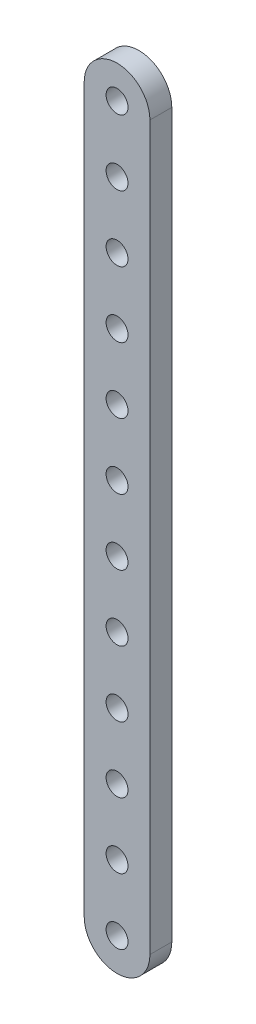
ISO-10303-21;
HEADER;
FILE_DESCRIPTION(('STEP AP214'),'2;1');
FILE_NAME('part.step','',(''),(''),'','','');
FILE_SCHEMA(('AUTOMOTIVE_DESIGN { 1 0 10303 214 1 1 1 1 }'));
ENDSEC;
DATA;
#1=APPLICATION_CONTEXT('core data for automotive mechanical design processes');
#2=APPLICATION_PROTOCOL_DEFINITION('international standard','automotive_design',2000,#1);
#3=PRODUCT_CONTEXT('',#1,'mechanical');
#4=PRODUCT('Part','Part','',(#3));
#5=PRODUCT_RELATED_PRODUCT_CATEGORY('part','',(#4));
#6=PRODUCT_DEFINITION_FORMATION('','',#4);
#7=PRODUCT_DEFINITION_CONTEXT('part definition',#1,'design');
#8=PRODUCT_DEFINITION('design','',#6,#7);
#9=PRODUCT_DEFINITION_SHAPE('','',#8);
#10=(LENGTH_UNIT() NAMED_UNIT(*) SI_UNIT(.MILLI.,.METRE.));
#11=(NAMED_UNIT(*) PLANE_ANGLE_UNIT() SI_UNIT($,.RADIAN.));
#12=(NAMED_UNIT(*) SI_UNIT($,.STERADIAN.) SOLID_ANGLE_UNIT());
#13=UNCERTAINTY_MEASURE_WITH_UNIT(LENGTH_MEASURE(1.E-05),#10,'distance_accuracy_value','');
#14=(GEOMETRIC_REPRESENTATION_CONTEXT(3) GLOBAL_UNCERTAINTY_ASSIGNED_CONTEXT((#13)) GLOBAL_UNIT_ASSIGNED_CONTEXT((#10,
#11,#12)) REPRESENTATION_CONTEXT('',''));
#15=CARTESIAN_POINT('',(0.,0.,0.));
#16=DIRECTION('',(0.,0.,1.));
#17=DIRECTION('',(1.,0.,0.));
#18=AXIS2_PLACEMENT_3D('',#15,#16,#17);
#19=CARTESIAN_POINT('',(208.7507761496,89.428489513,3.));
#20=DIRECTION('',(0.,0.,1.));
#21=DIRECTION('',(1.,0.,0.));
#22=AXIS2_PLACEMENT_3D('',#19,#20,#21);
#23=PLANE('',#22);
#24=CARTESIAN_POINT('',(208.7507761496,98.428489513,3.));
#25=DIRECTION('',(0.,0.,1.));
#26=DIRECTION('',(1.,0.,0.));
#27=AXIS2_PLACEMENT_3D('',#24,#25,#26);
#28=CIRCLE('',#27,1.5);
#29=CARTESIAN_POINT('',(210.2507761496,98.428489513,3.));
#30=VERTEX_POINT('',#29);
#31=EDGE_CURVE('E169',#30,#30,#28,.T.);
#32=ORIENTED_EDGE('',*,*,#31,.F.);
#33=EDGE_LOOP('',(#32));
#34=FACE_BOUND('',#33,.T.);
#35=CARTESIAN_POINT('',(208.7507761496,134.428489513,3.));
#36=DIRECTION('',(0.,0.,1.));
#37=DIRECTION('',(1.,0.,0.));
#38=AXIS2_PLACEMENT_3D('',#35,#36,#37);
#39=CIRCLE('',#38,1.5);
#40=CARTESIAN_POINT('',(210.2507761496,134.428489513,3.));
#41=VERTEX_POINT('',#40);
#42=EDGE_CURVE('E157',#41,#41,#39,.T.);
#43=ORIENTED_EDGE('',*,*,#42,.F.);
#44=EDGE_LOOP('',(#43));
#45=FACE_BOUND('',#44,.T.);
#46=CARTESIAN_POINT('',(208.7507761496,116.428489513,3.));
#47=DIRECTION('',(0.,0.,1.));
#48=DIRECTION('',(1.,0.,0.));
#49=AXIS2_PLACEMENT_3D('',#46,#47,#48);
#50=CIRCLE('',#49,1.5);
#51=CARTESIAN_POINT('',(210.2507761496,116.428489513,3.));
#52=VERTEX_POINT('',#51);
#53=EDGE_CURVE('E145',#52,#52,#50,.T.);
#54=ORIENTED_EDGE('',*,*,#53,.F.);
#55=EDGE_LOOP('',(#54));
#56=FACE_BOUND('',#55,.T.);
#57=CARTESIAN_POINT('',(208.7507761496,170.428489513,3.));
#58=DIRECTION('',(0.,0.,1.));
#59=DIRECTION('',(1.,0.,0.));
#60=AXIS2_PLACEMENT_3D('',#57,#58,#59);
#61=CIRCLE('',#60,1.5);
#62=CARTESIAN_POINT('',(210.2507761496,170.428489513,3.));
#63=VERTEX_POINT('',#62);
#64=EDGE_CURVE('E133',#63,#63,#61,.T.);
#65=ORIENTED_EDGE('',*,*,#64,.F.);
#66=EDGE_LOOP('',(#65));
#67=FACE_BOUND('',#66,.T.);
#68=CARTESIAN_POINT('',(208.7507761496,152.428489513,3.));
#69=DIRECTION('',(0.,0.,1.));
#70=DIRECTION('',(1.,0.,0.));
#71=AXIS2_PLACEMENT_3D('',#68,#69,#70);
#72=CIRCLE('',#71,1.5);
#73=CARTESIAN_POINT('',(210.2507761496,152.428489513,3.));
#74=VERTEX_POINT('',#73);
#75=EDGE_CURVE('E121',#74,#74,#72,.T.);
#76=ORIENTED_EDGE('',*,*,#75,.F.);
#77=EDGE_LOOP('',(#76));
#78=FACE_BOUND('',#77,.T.);
#79=CARTESIAN_POINT('',(208.7507761496,179.428489513,3.));
#80=DIRECTION('',(0.,0.,1.));
#81=DIRECTION('',(1.,0.,0.));
#82=AXIS2_PLACEMENT_3D('',#79,#80,#81);
#83=CIRCLE('',#82,1.5);
#84=CARTESIAN_POINT('',(210.2507761496,179.428489513,3.));
#85=VERTEX_POINT('',#84);
#86=EDGE_CURVE('E100',#85,#85,#83,.T.);
#87=ORIENTED_EDGE('',*,*,#86,.F.);
#88=EDGE_LOOP('',(#87));
#89=FACE_BOUND('',#88,.T.);
#90=CARTESIAN_POINT('',(208.7507761496,89.428489513,3.));
#91=DIRECTION('',(0.,0.,1.));
#92=DIRECTION('',(1.,0.,0.));
#93=AXIS2_PLACEMENT_3D('',#90,#91,#92);
#94=CIRCLE('',#93,4.5);
#95=CARTESIAN_POINT('',(204.2507761496,89.428489513,3.));
#96=VERTEX_POINT('',#95);
#97=CARTESIAN_POINT('',(213.2507761496,89.428489513,3.));
#98=VERTEX_POINT('',#97);
#99=EDGE_CURVE('E85',#96,#98,#94,.T.);
#100=ORIENTED_EDGE('',*,*,#99,.T.);
#101=DIRECTION('',(0.,1.,0.));
#102=VECTOR('',#101,1.);
#103=CARTESIAN_POINT('',(213.2507761496,89.428489513,3.));
#104=LINE('',#103,#102);
#105=CARTESIAN_POINT('',(213.2507761496,188.428489513,3.));
#106=VERTEX_POINT('',#105);
#107=EDGE_CURVE('E80',#98,#106,#104,.T.);
#108=ORIENTED_EDGE('',*,*,#107,.T.);
#109=CARTESIAN_POINT('',(208.7507761496,188.428489513,3.));
#110=DIRECTION('',(0.,0.,1.));
#111=DIRECTION('',(1.,0.,0.));
#112=AXIS2_PLACEMENT_3D('',#109,#110,#111);
#113=CIRCLE('',#112,4.5);
#114=CARTESIAN_POINT('',(204.2507761496,188.428489513,3.));
#115=VERTEX_POINT('',#114);
#116=EDGE_CURVE('E83',#106,#115,#113,.T.);
#117=ORIENTED_EDGE('',*,*,#116,.T.);
#118=DIRECTION('',(0.,-1.,0.));
#119=VECTOR('',#118,1.);
#120=CARTESIAN_POINT('',(204.2507761496,188.428489513,3.));
#121=LINE('',#120,#119);
#122=EDGE_CURVE('E50',#115,#96,#121,.T.);
#123=ORIENTED_EDGE('',*,*,#122,.T.);
#124=EDGE_LOOP('',(#100,#108,#117,#123));
#125=FACE_BOUND('',#124,.T.);
#126=CARTESIAN_POINT('',(208.7507761496,188.428489513,3.));
#127=DIRECTION('',(0.,0.,1.));
#128=DIRECTION('',(1.,0.,0.));
#129=AXIS2_PLACEMENT_3D('',#126,#127,#128);
#130=CIRCLE('',#129,1.5);
#131=CARTESIAN_POINT('',(210.2507761496,188.428489513,3.));
#132=VERTEX_POINT('',#131);
#133=EDGE_CURVE('E115',#132,#132,#130,.T.);
#134=ORIENTED_EDGE('',*,*,#133,.F.);
#135=EDGE_LOOP('',(#134));
#136=FACE_BOUND('',#135,.T.);
#137=CARTESIAN_POINT('',(208.7507761496,161.428489513,3.));
#138=DIRECTION('',(0.,0.,1.));
#139=DIRECTION('',(1.,0.,0.));
#140=AXIS2_PLACEMENT_3D('',#137,#138,#139);
#141=CIRCLE('',#140,1.5);
#142=CARTESIAN_POINT('',(210.2507761496,161.428489513,3.));
#143=VERTEX_POINT('',#142);
#144=EDGE_CURVE('E127',#143,#143,#141,.T.);
#145=ORIENTED_EDGE('',*,*,#144,.F.);
#146=EDGE_LOOP('',(#145));
#147=FACE_BOUND('',#146,.T.);
#148=CARTESIAN_POINT('',(208.7507761496,143.428489513,3.));
#149=DIRECTION('',(0.,0.,1.));
#150=DIRECTION('',(1.,0.,0.));
#151=AXIS2_PLACEMENT_3D('',#148,#149,#150);
#152=CIRCLE('',#151,1.5);
#153=CARTESIAN_POINT('',(210.2507761496,143.428489513,3.));
#154=VERTEX_POINT('',#153);
#155=EDGE_CURVE('E139',#154,#154,#152,.T.);
#156=ORIENTED_EDGE('',*,*,#155,.F.);
#157=EDGE_LOOP('',(#156));
#158=FACE_BOUND('',#157,.T.);
#159=CARTESIAN_POINT('',(208.7507761496,125.428489513,3.));
#160=DIRECTION('',(0.,0.,1.));
#161=DIRECTION('',(1.,0.,0.));
#162=AXIS2_PLACEMENT_3D('',#159,#160,#161);
#163=CIRCLE('',#162,1.5);
#164=CARTESIAN_POINT('',(210.2507761496,125.428489513,3.));
#165=VERTEX_POINT('',#164);
#166=EDGE_CURVE('E151',#165,#165,#163,.T.);
#167=ORIENTED_EDGE('',*,*,#166,.F.);
#168=EDGE_LOOP('',(#167));
#169=FACE_BOUND('',#168,.T.);
#170=CARTESIAN_POINT('',(208.7507761496,89.428489513,3.));
#171=DIRECTION('',(0.,0.,1.));
#172=DIRECTION('',(1.,0.,0.));
#173=AXIS2_PLACEMENT_3D('',#170,#171,#172);
#174=CIRCLE('',#173,1.5);
#175=CARTESIAN_POINT('',(210.2507761496,89.428489513,3.));
#176=VERTEX_POINT('',#175);
#177=EDGE_CURVE('E163',#176,#176,#174,.T.);
#178=ORIENTED_EDGE('',*,*,#177,.F.);
#179=EDGE_LOOP('',(#178));
#180=FACE_BOUND('',#179,.T.);
#181=CARTESIAN_POINT('',(208.7507761496,107.428489513,3.));
#182=DIRECTION('',(0.,0.,1.));
#183=DIRECTION('',(1.,0.,0.));
#184=AXIS2_PLACEMENT_3D('',#181,#182,#183);
#185=CIRCLE('',#184,1.5);
#186=CARTESIAN_POINT('',(210.2507761496,107.428489513,3.));
#187=VERTEX_POINT('',#186);
#188=EDGE_CURVE('E175',#187,#187,#185,.T.);
#189=ORIENTED_EDGE('',*,*,#188,.F.);
#190=EDGE_LOOP('',(#189));
#191=FACE_BOUND('',#190,.T.);
#192=ADVANCED_FACE('F33',(#34,#45,#56,#67,#78,#89,#125,#136,#147,#158,#169,#180,#191),#23,.T.);
#193=CARTESIAN_POINT('',(208.7507761496,89.428489513,0.));
#194=DIRECTION('',(0.,0.,1.));
#195=DIRECTION('',(1.,0.,0.));
#196=AXIS2_PLACEMENT_3D('',#193,#194,#195);
#197=PLANE('',#196);
#198=CARTESIAN_POINT('',(208.7507761496,98.428489513,0.));
#199=DIRECTION('',(0.,0.,1.));
#200=DIRECTION('',(1.,0.,0.));
#201=AXIS2_PLACEMENT_3D('',#198,#199,#200);
#202=CIRCLE('',#201,1.5);
#203=CARTESIAN_POINT('',(210.2507761496,98.428489513,0.));
#204=VERTEX_POINT('',#203);
#205=EDGE_CURVE('E172',#204,#204,#202,.T.);
#206=ORIENTED_EDGE('',*,*,#205,.T.);
#207=EDGE_LOOP('',(#206));
#208=FACE_BOUND('',#207,.T.);
#209=CARTESIAN_POINT('',(208.7507761496,134.428489513,0.));
#210=DIRECTION('',(0.,0.,1.));
#211=DIRECTION('',(1.,0.,0.));
#212=AXIS2_PLACEMENT_3D('',#209,#210,#211);
#213=CIRCLE('',#212,1.5);
#214=CARTESIAN_POINT('',(210.2507761496,134.428489513,0.));
#215=VERTEX_POINT('',#214);
#216=EDGE_CURVE('E160',#215,#215,#213,.T.);
#217=ORIENTED_EDGE('',*,*,#216,.T.);
#218=EDGE_LOOP('',(#217));
#219=FACE_BOUND('',#218,.T.);
#220=CARTESIAN_POINT('',(208.7507761496,116.428489513,0.));
#221=DIRECTION('',(0.,0.,1.));
#222=DIRECTION('',(1.,0.,0.));
#223=AXIS2_PLACEMENT_3D('',#220,#221,#222);
#224=CIRCLE('',#223,1.5);
#225=CARTESIAN_POINT('',(210.2507761496,116.428489513,0.));
#226=VERTEX_POINT('',#225);
#227=EDGE_CURVE('E148',#226,#226,#224,.T.);
#228=ORIENTED_EDGE('',*,*,#227,.T.);
#229=EDGE_LOOP('',(#228));
#230=FACE_BOUND('',#229,.T.);
#231=CARTESIAN_POINT('',(208.7507761496,170.428489513,0.));
#232=DIRECTION('',(0.,0.,1.));
#233=DIRECTION('',(1.,0.,0.));
#234=AXIS2_PLACEMENT_3D('',#231,#232,#233);
#235=CIRCLE('',#234,1.5);
#236=CARTESIAN_POINT('',(210.2507761496,170.428489513,0.));
#237=VERTEX_POINT('',#236);
#238=EDGE_CURVE('E136',#237,#237,#235,.T.);
#239=ORIENTED_EDGE('',*,*,#238,.T.);
#240=EDGE_LOOP('',(#239));
#241=FACE_BOUND('',#240,.T.);
#242=CARTESIAN_POINT('',(208.7507761496,152.428489513,0.));
#243=DIRECTION('',(0.,0.,1.));
#244=DIRECTION('',(1.,0.,0.));
#245=AXIS2_PLACEMENT_3D('',#242,#243,#244);
#246=CIRCLE('',#245,1.5);
#247=CARTESIAN_POINT('',(210.2507761496,152.428489513,0.));
#248=VERTEX_POINT('',#247);
#249=EDGE_CURVE('E124',#248,#248,#246,.T.);
#250=ORIENTED_EDGE('',*,*,#249,.T.);
#251=EDGE_LOOP('',(#250));
#252=FACE_BOUND('',#251,.T.);
#253=CARTESIAN_POINT('',(208.7507761496,179.428489513,0.));
#254=DIRECTION('',(0.,0.,1.));
#255=DIRECTION('',(1.,0.,0.));
#256=AXIS2_PLACEMENT_3D('',#253,#254,#255);
#257=CIRCLE('',#256,1.5);
#258=CARTESIAN_POINT('',(210.2507761496,179.428489513,0.));
#259=VERTEX_POINT('',#258);
#260=EDGE_CURVE('E112',#259,#259,#257,.T.);
#261=ORIENTED_EDGE('',*,*,#260,.T.);
#262=EDGE_LOOP('',(#261));
#263=FACE_BOUND('',#262,.T.);
#264=CARTESIAN_POINT('',(208.7507761496,89.428489513,0.));
#265=DIRECTION('',(0.,0.,1.));
#266=DIRECTION('',(1.,0.,0.));
#267=AXIS2_PLACEMENT_3D('',#264,#265,#266);
#268=CIRCLE('',#267,4.5);
#269=CARTESIAN_POINT('',(204.2507761496,89.428489513,0.));
#270=VERTEX_POINT('',#269);
#271=CARTESIAN_POINT('',(213.2507761496,89.428489513,0.));
#272=VERTEX_POINT('',#271);
#273=EDGE_CURVE('E97',#270,#272,#268,.T.);
#274=ORIENTED_EDGE('',*,*,#273,.F.);
#275=DIRECTION('',(0.,-1.,0.));
#276=VECTOR('',#275,1.);
#277=CARTESIAN_POINT('',(204.2507761496,188.428489513,0.));
#278=LINE('',#277,#276);
#279=CARTESIAN_POINT('',(204.2507761496,188.428489513,0.));
#280=VERTEX_POINT('',#279);
#281=EDGE_CURVE('E73',#280,#270,#278,.T.);
#282=ORIENTED_EDGE('',*,*,#281,.F.);
#283=CARTESIAN_POINT('',(208.7507761496,188.428489513,0.));
#284=DIRECTION('',(0.,0.,1.));
#285=DIRECTION('',(1.,0.,0.));
#286=AXIS2_PLACEMENT_3D('',#283,#284,#285);
#287=CIRCLE('',#286,4.5);
#288=CARTESIAN_POINT('',(213.2507761496,188.428489513,0.));
#289=VERTEX_POINT('',#288);
#290=EDGE_CURVE('E67',#289,#280,#287,.T.);
#291=ORIENTED_EDGE('',*,*,#290,.F.);
#292=DIRECTION('',(0.,1.,0.));
#293=VECTOR('',#292,1.);
#294=CARTESIAN_POINT('',(213.2507761496,89.428489513,0.));
#295=LINE('',#294,#293);
#296=EDGE_CURVE('E89',#272,#289,#295,.T.);
#297=ORIENTED_EDGE('',*,*,#296,.F.);
#298=EDGE_LOOP('',(#274,#282,#291,#297));
#299=FACE_BOUND('',#298,.T.);
#300=CARTESIAN_POINT('',(208.7507761496,188.428489513,0.));
#301=DIRECTION('',(0.,0.,1.));
#302=DIRECTION('',(1.,0.,0.));
#303=AXIS2_PLACEMENT_3D('',#300,#301,#302);
#304=CIRCLE('',#303,1.5);
#305=CARTESIAN_POINT('',(210.2507761496,188.428489513,0.));
#306=VERTEX_POINT('',#305);
#307=EDGE_CURVE('E118',#306,#306,#304,.T.);
#308=ORIENTED_EDGE('',*,*,#307,.T.);
#309=EDGE_LOOP('',(#308));
#310=FACE_BOUND('',#309,.T.);
#311=CARTESIAN_POINT('',(208.7507761496,161.428489513,0.));
#312=DIRECTION('',(0.,0.,1.));
#313=DIRECTION('',(1.,0.,0.));
#314=AXIS2_PLACEMENT_3D('',#311,#312,#313);
#315=CIRCLE('',#314,1.5);
#316=CARTESIAN_POINT('',(210.2507761496,161.428489513,0.));
#317=VERTEX_POINT('',#316);
#318=EDGE_CURVE('E130',#317,#317,#315,.T.);
#319=ORIENTED_EDGE('',*,*,#318,.T.);
#320=EDGE_LOOP('',(#319));
#321=FACE_BOUND('',#320,.T.);
#322=CARTESIAN_POINT('',(208.7507761496,143.428489513,0.));
#323=DIRECTION('',(0.,0.,1.));
#324=DIRECTION('',(1.,0.,0.));
#325=AXIS2_PLACEMENT_3D('',#322,#323,#324);
#326=CIRCLE('',#325,1.5);
#327=CARTESIAN_POINT('',(210.2507761496,143.428489513,0.));
#328=VERTEX_POINT('',#327);
#329=EDGE_CURVE('E142',#328,#328,#326,.T.);
#330=ORIENTED_EDGE('',*,*,#329,.T.);
#331=EDGE_LOOP('',(#330));
#332=FACE_BOUND('',#331,.T.);
#333=CARTESIAN_POINT('',(208.7507761496,125.428489513,0.));
#334=DIRECTION('',(0.,0.,1.));
#335=DIRECTION('',(1.,0.,0.));
#336=AXIS2_PLACEMENT_3D('',#333,#334,#335);
#337=CIRCLE('',#336,1.5);
#338=CARTESIAN_POINT('',(210.2507761496,125.428489513,0.));
#339=VERTEX_POINT('',#338);
#340=EDGE_CURVE('E154',#339,#339,#337,.T.);
#341=ORIENTED_EDGE('',*,*,#340,.T.);
#342=EDGE_LOOP('',(#341));
#343=FACE_BOUND('',#342,.T.);
#344=CARTESIAN_POINT('',(208.7507761496,89.428489513,0.));
#345=DIRECTION('',(0.,0.,1.));
#346=DIRECTION('',(1.,0.,0.));
#347=AXIS2_PLACEMENT_3D('',#344,#345,#346);
#348=CIRCLE('',#347,1.5);
#349=CARTESIAN_POINT('',(210.2507761496,89.428489513,0.));
#350=VERTEX_POINT('',#349);
#351=EDGE_CURVE('E166',#350,#350,#348,.T.);
#352=ORIENTED_EDGE('',*,*,#351,.T.);
#353=EDGE_LOOP('',(#352));
#354=FACE_BOUND('',#353,.T.);
#355=CARTESIAN_POINT('',(208.7507761496,107.428489513,0.));
#356=DIRECTION('',(0.,0.,1.));
#357=DIRECTION('',(1.,0.,0.));
#358=AXIS2_PLACEMENT_3D('',#355,#356,#357);
#359=CIRCLE('',#358,1.5);
#360=CARTESIAN_POINT('',(210.2507761496,107.428489513,0.));
#361=VERTEX_POINT('',#360);
#362=EDGE_CURVE('E178',#361,#361,#359,.T.);
#363=ORIENTED_EDGE('',*,*,#362,.T.);
#364=EDGE_LOOP('',(#363));
#365=FACE_BOUND('',#364,.T.);
#366=ADVANCED_FACE('F108',(#208,#219,#230,#241,#252,#263,#299,#310,#321,#332,#343,#354,#365),
#197,.F.);
#367=CARTESIAN_POINT('',(208.7507761496,89.428489513,3.));
#368=DIRECTION('',(0.,0.,-1.));
#369=DIRECTION('',(-1.,0.,0.));
#370=AXIS2_PLACEMENT_3D('',#367,#368,#369);
#371=CYLINDRICAL_SURFACE('',#370,4.5);
#372=ORIENTED_EDGE('',*,*,#273,.T.);
#373=DIRECTION('',(0.,0.,-1.));
#374=VECTOR('',#373,1.);
#375=CARTESIAN_POINT('',(213.2507761496,89.428489513,3.));
#376=LINE('',#375,#374);
#377=EDGE_CURVE('E11',#98,#272,#376,.T.);
#378=ORIENTED_EDGE('',*,*,#377,.F.);
#379=ORIENTED_EDGE('',*,*,#99,.F.);
#380=DIRECTION('',(0.,0.,-1.));
#381=VECTOR('',#380,1.);
#382=CARTESIAN_POINT('',(204.2507761496,89.428489513,3.));
#383=LINE('',#382,#381);
#384=EDGE_CURVE('E93',#96,#270,#383,.T.);
#385=ORIENTED_EDGE('',*,*,#384,.T.);
#386=EDGE_LOOP('',(#372,#378,#379,#385));
#387=FACE_BOUND('',#386,.T.);
#388=ADVANCED_FACE('F35',(#387),#371,.T.);
#389=CARTESIAN_POINT('',(213.2507761496,89.428489513,3.));
#390=DIRECTION('',(-1.,0.,0.));
#391=DIRECTION('',(0.,0.,1.));
#392=AXIS2_PLACEMENT_3D('',#389,#390,#391);
#393=PLANE('',#392);
#394=ORIENTED_EDGE('',*,*,#296,.T.);
#395=DIRECTION('',(0.,0.,-1.));
#396=VECTOR('',#395,1.);
#397=CARTESIAN_POINT('',(213.2507761496,188.428489513,3.));
#398=LINE('',#397,#396);
#399=EDGE_CURVE('E42',#106,#289,#398,.T.);
#400=ORIENTED_EDGE('',*,*,#399,.F.);
#401=ORIENTED_EDGE('',*,*,#107,.F.);
#402=ORIENTED_EDGE('',*,*,#377,.T.);
#403=EDGE_LOOP('',(#394,#400,#401,#402));
#404=FACE_BOUND('',#403,.T.);
#405=ADVANCED_FACE('F88',(#404),#393,.F.);
#406=CARTESIAN_POINT('',(208.7507761496,188.428489513,3.));
#407=DIRECTION('',(0.,0.,-1.));
#408=DIRECTION('',(-1.,0.,0.));
#409=AXIS2_PLACEMENT_3D('',#406,#407,#408);
#410=CYLINDRICAL_SURFACE('',#409,4.5);
#411=ORIENTED_EDGE('',*,*,#290,.T.);
#412=DIRECTION('',(0.,0.,-1.));
#413=VECTOR('',#412,1.);
#414=CARTESIAN_POINT('',(204.2507761496,188.428489513,3.));
#415=LINE('',#414,#413);
#416=EDGE_CURVE('E90',#115,#280,#415,.T.);
#417=ORIENTED_EDGE('',*,*,#416,.F.);
#418=ORIENTED_EDGE('',*,*,#116,.F.);
#419=ORIENTED_EDGE('',*,*,#399,.T.);
#420=EDGE_LOOP('',(#411,#417,#418,#419));
#421=FACE_BOUND('',#420,.T.);
#422=ADVANCED_FACE('F91',(#421),#410,.T.);
#423=CARTESIAN_POINT('',(204.2507761496,188.428489513,3.));
#424=DIRECTION('',(1.,0.,0.));
#425=DIRECTION('',(0.,0.,-1.));
#426=AXIS2_PLACEMENT_3D('',#423,#424,#425);
#427=PLANE('',#426);
#428=ORIENTED_EDGE('',*,*,#281,.T.);
#429=ORIENTED_EDGE('',*,*,#384,.F.);
#430=ORIENTED_EDGE('',*,*,#122,.F.);
#431=ORIENTED_EDGE('',*,*,#416,.T.);
#432=EDGE_LOOP('',(#428,#429,#430,#431));
#433=FACE_BOUND('',#432,.T.);
#434=ADVANCED_FACE('F105',(#433),#427,.F.);
#435=CARTESIAN_POINT('',(208.7507761496,179.428489513,3.));
#436=DIRECTION('',(0.,0.,-1.));
#437=DIRECTION('',(-1.,0.,0.));
#438=AXIS2_PLACEMENT_3D('',#435,#436,#437);
#439=CYLINDRICAL_SURFACE('',#438,1.5);
#440=ORIENTED_EDGE('',*,*,#86,.T.);
#441=EDGE_LOOP('',(#440));
#442=FACE_BOUND('',#441,.T.);
#443=ORIENTED_EDGE('',*,*,#260,.F.);
#444=EDGE_LOOP('',(#443));
#445=FACE_BOUND('',#444,.T.);
#446=ADVANCED_FACE('F198',(#442,#445),#439,.F.);
#447=CARTESIAN_POINT('',(208.7507761496,188.428489513,3.));
#448=DIRECTION('',(0.,0.,-1.));
#449=DIRECTION('',(-1.,0.,0.));
#450=AXIS2_PLACEMENT_3D('',#447,#448,#449);
#451=CYLINDRICAL_SURFACE('',#450,1.5);
#452=ORIENTED_EDGE('',*,*,#133,.T.);
#453=EDGE_LOOP('',(#452));
#454=FACE_BOUND('',#453,.T.);
#455=ORIENTED_EDGE('',*,*,#307,.F.);
#456=EDGE_LOOP('',(#455));
#457=FACE_BOUND('',#456,.T.);
#458=ADVANCED_FACE('F244',(#454,#457),#451,.F.);
#459=CARTESIAN_POINT('',(208.7507761496,152.428489513,3.));
#460=DIRECTION('',(0.,0.,-1.));
#461=DIRECTION('',(-1.,0.,0.));
#462=AXIS2_PLACEMENT_3D('',#459,#460,#461);
#463=CYLINDRICAL_SURFACE('',#462,1.5);
#464=ORIENTED_EDGE('',*,*,#75,.T.);
#465=EDGE_LOOP('',(#464));
#466=FACE_BOUND('',#465,.T.);
#467=ORIENTED_EDGE('',*,*,#249,.F.);
#468=EDGE_LOOP('',(#467));
#469=FACE_BOUND('',#468,.T.);
#470=ADVANCED_FACE('F252',(#466,#469),#463,.F.);
#471=CARTESIAN_POINT('',(208.7507761496,161.428489513,3.));
#472=DIRECTION('',(0.,0.,-1.));
#473=DIRECTION('',(-1.,0.,0.));
#474=AXIS2_PLACEMENT_3D('',#471,#472,#473);
#475=CYLINDRICAL_SURFACE('',#474,1.5);
#476=ORIENTED_EDGE('',*,*,#144,.T.);
#477=EDGE_LOOP('',(#476));
#478=FACE_BOUND('',#477,.T.);
#479=ORIENTED_EDGE('',*,*,#318,.F.);
#480=EDGE_LOOP('',(#479));
#481=FACE_BOUND('',#480,.T.);
#482=ADVANCED_FACE('F260',(#478,#481),#475,.F.);
#483=CARTESIAN_POINT('',(208.7507761496,170.428489513,3.));
#484=DIRECTION('',(0.,0.,-1.));
#485=DIRECTION('',(-1.,0.,0.));
#486=AXIS2_PLACEMENT_3D('',#483,#484,#485);
#487=CYLINDRICAL_SURFACE('',#486,1.5);
#488=ORIENTED_EDGE('',*,*,#64,.T.);
#489=EDGE_LOOP('',(#488));
#490=FACE_BOUND('',#489,.T.);
#491=ORIENTED_EDGE('',*,*,#238,.F.);
#492=EDGE_LOOP('',(#491));
#493=FACE_BOUND('',#492,.T.);
#494=ADVANCED_FACE('F269',(#490,#493),#487,.F.);
#495=CARTESIAN_POINT('',(208.7507761496,143.428489513,3.));
#496=DIRECTION('',(0.,0.,-1.));
#497=DIRECTION('',(-1.,0.,0.));
#498=AXIS2_PLACEMENT_3D('',#495,#496,#497);
#499=CYLINDRICAL_SURFACE('',#498,1.5);
#500=ORIENTED_EDGE('',*,*,#155,.T.);
#501=EDGE_LOOP('',(#500));
#502=FACE_BOUND('',#501,.T.);
#503=ORIENTED_EDGE('',*,*,#329,.F.);
#504=EDGE_LOOP('',(#503));
#505=FACE_BOUND('',#504,.T.);
#506=ADVANCED_FACE('F278',(#502,#505),#499,.F.);
#507=CARTESIAN_POINT('',(208.7507761496,116.428489513,3.));
#508=DIRECTION('',(0.,0.,-1.));
#509=DIRECTION('',(-1.,0.,0.));
#510=AXIS2_PLACEMENT_3D('',#507,#508,#509);
#511=CYLINDRICAL_SURFACE('',#510,1.5);
#512=ORIENTED_EDGE('',*,*,#53,.T.);
#513=EDGE_LOOP('',(#512));
#514=FACE_BOUND('',#513,.T.);
#515=ORIENTED_EDGE('',*,*,#227,.F.);
#516=EDGE_LOOP('',(#515));
#517=FACE_BOUND('',#516,.T.);
#518=ADVANCED_FACE('F287',(#514,#517),#511,.F.);
#519=CARTESIAN_POINT('',(208.7507761496,125.428489513,3.));
#520=DIRECTION('',(0.,0.,-1.));
#521=DIRECTION('',(-1.,0.,0.));
#522=AXIS2_PLACEMENT_3D('',#519,#520,#521);
#523=CYLINDRICAL_SURFACE('',#522,1.5);
#524=ORIENTED_EDGE('',*,*,#166,.T.);
#525=EDGE_LOOP('',(#524));
#526=FACE_BOUND('',#525,.T.);
#527=ORIENTED_EDGE('',*,*,#340,.F.);
#528=EDGE_LOOP('',(#527));
#529=FACE_BOUND('',#528,.T.);
#530=ADVANCED_FACE('F296',(#526,#529),#523,.F.);
#531=CARTESIAN_POINT('',(208.7507761496,134.428489513,3.));
#532=DIRECTION('',(0.,0.,-1.));
#533=DIRECTION('',(-1.,0.,0.));
#534=AXIS2_PLACEMENT_3D('',#531,#532,#533);
#535=CYLINDRICAL_SURFACE('',#534,1.5);
#536=ORIENTED_EDGE('',*,*,#42,.T.);
#537=EDGE_LOOP('',(#536));
#538=FACE_BOUND('',#537,.T.);
#539=ORIENTED_EDGE('',*,*,#216,.F.);
#540=EDGE_LOOP('',(#539));
#541=FACE_BOUND('',#540,.T.);
#542=ADVANCED_FACE('F305',(#538,#541),#535,.F.);
#543=CARTESIAN_POINT('',(208.7507761496,89.428489513,3.));
#544=DIRECTION('',(0.,0.,-1.));
#545=DIRECTION('',(-1.,0.,0.));
#546=AXIS2_PLACEMENT_3D('',#543,#544,#545);
#547=CYLINDRICAL_SURFACE('',#546,1.5);
#548=ORIENTED_EDGE('',*,*,#177,.T.);
#549=EDGE_LOOP('',(#548));
#550=FACE_BOUND('',#549,.T.);
#551=ORIENTED_EDGE('',*,*,#351,.F.);
#552=EDGE_LOOP('',(#551));
#553=FACE_BOUND('',#552,.T.);
#554=ADVANCED_FACE('F314',(#550,#553),#547,.F.);
#555=CARTESIAN_POINT('',(208.7507761496,98.428489513,3.));
#556=DIRECTION('',(0.,0.,-1.));
#557=DIRECTION('',(-1.,0.,0.));
#558=AXIS2_PLACEMENT_3D('',#555,#556,#557);
#559=CYLINDRICAL_SURFACE('',#558,1.5);
#560=ORIENTED_EDGE('',*,*,#31,.T.);
#561=EDGE_LOOP('',(#560));
#562=FACE_BOUND('',#561,.T.);
#563=ORIENTED_EDGE('',*,*,#205,.F.);
#564=EDGE_LOOP('',(#563));
#565=FACE_BOUND('',#564,.T.);
#566=ADVANCED_FACE('F323',(#562,#565),#559,.F.);
#567=CARTESIAN_POINT('',(208.7507761496,107.428489513,3.));
#568=DIRECTION('',(0.,0.,-1.));
#569=DIRECTION('',(-1.,0.,0.));
#570=AXIS2_PLACEMENT_3D('',#567,#568,#569);
#571=CYLINDRICAL_SURFACE('',#570,1.5);
#572=ORIENTED_EDGE('',*,*,#188,.T.);
#573=EDGE_LOOP('',(#572));
#574=FACE_BOUND('',#573,.T.);
#575=ORIENTED_EDGE('',*,*,#362,.F.);
#576=EDGE_LOOP('',(#575));
#577=FACE_BOUND('',#576,.T.);
#578=ADVANCED_FACE('F184',(#574,#577),#571,.F.);
#579=CLOSED_SHELL('',(#192,#366,#388,#405,#422,#434,#446,#458,#470,#482,#494,#506,#518,#530,
#542,#554,#566,#578));
#580=MANIFOLD_SOLID_BREP('B2',#579);
#581=ADVANCED_BREP_SHAPE_REPRESENTATION('',(#18,#580),#14);
#582=SHAPE_DEFINITION_REPRESENTATION(#9,#581);
ENDSEC;
END-ISO-10303-21;
